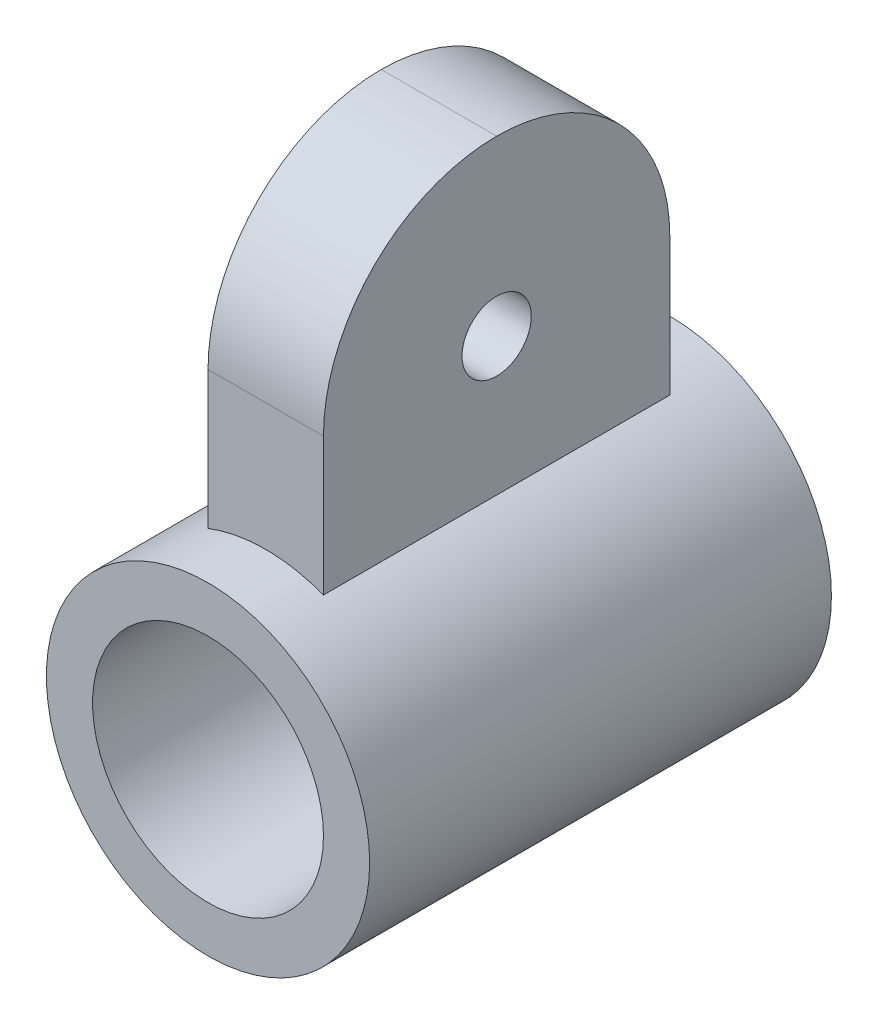
ISO-10303-21;
HEADER;
FILE_DESCRIPTION(('STEP AP214'),'2;1');
FILE_NAME('part.step','',(''),(''),'','','');
FILE_SCHEMA(('AUTOMOTIVE_DESIGN { 1 0 10303 214 1 1 1 1 }'));
ENDSEC;
DATA;
#1=APPLICATION_CONTEXT('core data for automotive mechanical design processes');
#2=APPLICATION_PROTOCOL_DEFINITION('international standard','automotive_design',2000,#1);
#3=PRODUCT_CONTEXT('',#1,'mechanical');
#4=PRODUCT('Part','Part','',(#3));
#5=PRODUCT_RELATED_PRODUCT_CATEGORY('part','',(#4));
#6=PRODUCT_DEFINITION_FORMATION('','',#4);
#7=PRODUCT_DEFINITION_CONTEXT('part definition',#1,'design');
#8=PRODUCT_DEFINITION('design','',#6,#7);
#9=PRODUCT_DEFINITION_SHAPE('','',#8);
#10=(LENGTH_UNIT() NAMED_UNIT(*) SI_UNIT(.MILLI.,.METRE.));
#11=(NAMED_UNIT(*) PLANE_ANGLE_UNIT() SI_UNIT($,.RADIAN.));
#12=(NAMED_UNIT(*) SI_UNIT($,.STERADIAN.) SOLID_ANGLE_UNIT());
#13=UNCERTAINTY_MEASURE_WITH_UNIT(LENGTH_MEASURE(1.E-05),#10,'distance_accuracy_value','');
#14=(GEOMETRIC_REPRESENTATION_CONTEXT(3) GLOBAL_UNCERTAINTY_ASSIGNED_CONTEXT((#13)) GLOBAL_UNIT_ASSIGNED_CONTEXT((#10,
#11,#12)) REPRESENTATION_CONTEXT('',''));
#15=CARTESIAN_POINT('',(0.,0.,0.));
#16=DIRECTION('',(0.,0.,1.));
#17=DIRECTION('',(1.,0.,0.));
#18=AXIS2_PLACEMENT_3D('',#15,#16,#17);
#19=CARTESIAN_POINT('',(0.,0.,20.));
#20=DIRECTION('',(0.,0.,1.));
#21=DIRECTION('',(1.,0.,0.));
#22=AXIS2_PLACEMENT_3D('',#19,#20,#21);
#23=PLANE('',#22);
#24=CARTESIAN_POINT('',(0.,0.,20.));
#25=DIRECTION('',(0.,0.,1.));
#26=DIRECTION('',(1.,0.,0.));
#27=AXIS2_PLACEMENT_3D('',#24,#25,#26);
#28=CIRCLE('',#27,14.);
#29=CARTESIAN_POINT('',(14.,0.,20.));
#30=VERTEX_POINT('',#29);
#31=EDGE_CURVE('E116',#30,#30,#28,.T.);
#32=ORIENTED_EDGE('',*,*,#31,.T.);
#33=EDGE_LOOP('',(#32));
#34=FACE_BOUND('',#33,.T.);
#35=CARTESIAN_POINT('',(0.,0.,20.));
#36=DIRECTION('',(0.,0.,1.));
#37=DIRECTION('',(1.,0.,0.));
#38=AXIS2_PLACEMENT_3D('',#35,#36,#37);
#39=CIRCLE('',#38,10.);
#40=CARTESIAN_POINT('',(10.,0.,20.));
#41=VERTEX_POINT('',#40);
#42=EDGE_CURVE('E110',#41,#41,#39,.T.);
#43=ORIENTED_EDGE('',*,*,#42,.F.);
#44=EDGE_LOOP('',(#43));
#45=FACE_BOUND('',#44,.T.);
#46=ADVANCED_FACE('F32',(#34,#45),#23,.T.);
#47=CARTESIAN_POINT('',(0.,0.,-20.));
#48=DIRECTION('',(0.,0.,1.));
#49=DIRECTION('',(1.,0.,0.));
#50=AXIS2_PLACEMENT_3D('',#47,#48,#49);
#51=PLANE('',#50);
#52=CARTESIAN_POINT('',(0.,0.,-20.));
#53=DIRECTION('',(0.,0.,1.));
#54=DIRECTION('',(1.,0.,0.));
#55=AXIS2_PLACEMENT_3D('',#52,#53,#54);
#56=CIRCLE('',#55,14.);
#57=CARTESIAN_POINT('',(14.,0.,-20.));
#58=VERTEX_POINT('',#57);
#59=EDGE_CURVE('E113',#58,#58,#56,.T.);
#60=ORIENTED_EDGE('',*,*,#59,.F.);
#61=EDGE_LOOP('',(#60));
#62=FACE_BOUND('',#61,.T.);
#63=CARTESIAN_POINT('',(0.,0.,-20.));
#64=DIRECTION('',(0.,0.,1.));
#65=DIRECTION('',(1.,0.,0.));
#66=AXIS2_PLACEMENT_3D('',#63,#64,#65);
#67=CIRCLE('',#66,10.);
#68=CARTESIAN_POINT('',(10.,0.,-20.));
#69=VERTEX_POINT('',#68);
#70=EDGE_CURVE('E105',#69,#69,#67,.T.);
#71=ORIENTED_EDGE('',*,*,#70,.T.);
#72=EDGE_LOOP('',(#71));
#73=FACE_BOUND('',#72,.T.);
#74=ADVANCED_FACE('F158',(#62,#73),#51,.F.);
#75=CARTESIAN_POINT('',(0.,0.,20.));
#76=DIRECTION('',(0.,0.,-1.));
#77=DIRECTION('',(-1.,0.,0.));
#78=AXIS2_PLACEMENT_3D('',#75,#76,#77);
#79=CYLINDRICAL_SURFACE('',#78,14.);
#80=DIRECTION('',(0.,0.,-1.));
#81=VECTOR('',#80,1.);
#82=CARTESIAN_POINT('',(-5.,13.076696830622,20.));
#83=LINE('',#82,#81);
#84=CARTESIAN_POINT('',(-5.,13.076696830622,-15.));
#85=VERTEX_POINT('',#84);
#86=CARTESIAN_POINT('',(-5.,13.076696830622,15.));
#87=VERTEX_POINT('',#86);
#88=EDGE_CURVE('E78',#85,#87,#83,.F.);
#89=ORIENTED_EDGE('',*,*,#88,.F.);
#90=CARTESIAN_POINT('',(0.,0.,-15.));
#91=DIRECTION('',(0.,0.,-1.));
#92=DIRECTION('',(-1.,0.,0.));
#93=AXIS2_PLACEMENT_3D('',#90,#91,#92);
#94=CIRCLE('',#93,14.);
#95=CARTESIAN_POINT('',(5.,13.076696830622,-15.));
#96=VERTEX_POINT('',#95);
#97=EDGE_CURVE('E87',#96,#85,#94,.F.);
#98=ORIENTED_EDGE('',*,*,#97,.F.);
#99=DIRECTION('',(0.,0.,-1.));
#100=VECTOR('',#99,1.);
#101=CARTESIAN_POINT('',(5.,13.076696830622,20.));
#102=LINE('',#101,#100);
#103=CARTESIAN_POINT('',(5.,13.076696830622,15.));
#104=VERTEX_POINT('',#103);
#105=EDGE_CURVE('E98',#104,#96,#102,.T.);
#106=ORIENTED_EDGE('',*,*,#105,.F.);
#107=CARTESIAN_POINT('',(0.,0.,15.));
#108=DIRECTION('',(0.,0.,1.));
#109=DIRECTION('',(1.,0.,0.));
#110=AXIS2_PLACEMENT_3D('',#107,#108,#109);
#111=CIRCLE('',#110,14.);
#112=EDGE_CURVE('E96',#87,#104,#111,.F.);
#113=ORIENTED_EDGE('',*,*,#112,.F.);
#114=EDGE_LOOP('',(#89,#98,#106,#113));
#115=FACE_BOUND('',#114,.T.);
#116=ORIENTED_EDGE('',*,*,#31,.F.);
#117=EDGE_LOOP('',(#116));
#118=FACE_BOUND('',#117,.T.);
#119=ORIENTED_EDGE('',*,*,#59,.T.);
#120=EDGE_LOOP('',(#119));
#121=FACE_BOUND('',#120,.T.);
#122=ADVANCED_FACE('F94',(#115,#118,#121),#79,.T.);
#123=CARTESIAN_POINT('',(0.,0.,20.));
#124=DIRECTION('',(0.,0.,-1.));
#125=DIRECTION('',(-1.,0.,0.));
#126=AXIS2_PLACEMENT_3D('',#123,#124,#125);
#127=CYLINDRICAL_SURFACE('',#126,10.);
#128=ORIENTED_EDGE('',*,*,#42,.T.);
#129=EDGE_LOOP('',(#128));
#130=FACE_BOUND('',#129,.T.);
#131=ORIENTED_EDGE('',*,*,#70,.F.);
#132=EDGE_LOOP('',(#131));
#133=FACE_BOUND('',#132,.T.);
#134=ADVANCED_FACE('F168',(#130,#133),#127,.F.);
#135=CARTESIAN_POINT('',(-5.,-14.001,-15.));
#136=DIRECTION('',(0.,0.,-1.));
#137=DIRECTION('',(-1.,0.,0.));
#138=AXIS2_PLACEMENT_3D('',#135,#136,#137);
#139=PLANE('',#138);
#140=DIRECTION('',(0.,1.,0.));
#141=VECTOR('',#140,1.);
#142=CARTESIAN_POINT('',(-5.,-14.001,-15.));
#143=LINE('',#142,#141);
#144=CARTESIAN_POINT('',(-5.,25.,-15.));
#145=VERTEX_POINT('',#144);
#146=EDGE_CURVE('E74',#85,#145,#143,.T.);
#147=ORIENTED_EDGE('',*,*,#146,.T.);
#148=DIRECTION('',(-1.,0.,0.));
#149=VECTOR('',#148,1.);
#150=CARTESIAN_POINT('',(-5.,25.,-15.));
#151=LINE('',#150,#149);
#152=CARTESIAN_POINT('',(5.,25.,-15.));
#153=VERTEX_POINT('',#152);
#154=EDGE_CURVE('E11',#145,#153,#151,.F.);
#155=ORIENTED_EDGE('',*,*,#154,.T.);
#156=DIRECTION('',(0.,1.,0.));
#157=VECTOR('',#156,1.);
#158=CARTESIAN_POINT('',(5.,-14.001,-15.));
#159=LINE('',#158,#157);
#160=EDGE_CURVE('E83',#96,#153,#159,.T.);
#161=ORIENTED_EDGE('',*,*,#160,.F.);
#162=ORIENTED_EDGE('',*,*,#97,.T.);
#163=EDGE_LOOP('',(#147,#155,#161,#162));
#164=FACE_BOUND('',#163,.T.);
#165=ADVANCED_FACE('F88',(#164),#139,.T.);
#166=CARTESIAN_POINT('',(-5.,-14.001,-15.));
#167=DIRECTION('',(-1.,0.,0.));
#168=DIRECTION('',(0.,0.,1.));
#169=AXIS2_PLACEMENT_3D('',#166,#167,#168);
#170=PLANE('',#169);
#171=CARTESIAN_POINT('',(-5.,25.,0.));
#172=DIRECTION('',(-1.,0.,0.));
#173=DIRECTION('',(0.,0.,1.));
#174=AXIS2_PLACEMENT_3D('',#171,#172,#173);
#175=CIRCLE('',#174,3.);
#176=CARTESIAN_POINT('',(-5.,25.,3.));
#177=VERTEX_POINT('',#176);
#178=EDGE_CURVE('E140',#177,#177,#175,.T.);
#179=ORIENTED_EDGE('',*,*,#178,.F.);
#180=EDGE_LOOP('',(#179));
#181=FACE_BOUND('',#180,.T.);
#182=DIRECTION('',(0.,1.,0.));
#183=VECTOR('',#182,1.);
#184=CARTESIAN_POINT('',(-5.,-14.001,15.));
#185=LINE('',#184,#183);
#186=CARTESIAN_POINT('',(-5.,25.,15.));
#187=VERTEX_POINT('',#186);
#188=EDGE_CURVE('E82',#87,#187,#185,.T.);
#189=ORIENTED_EDGE('',*,*,#188,.T.);
#190=CARTESIAN_POINT('',(-5.,25.,0.));
#191=DIRECTION('',(-1.,0.,0.));
#192=DIRECTION('',(0.,0.,1.));
#193=AXIS2_PLACEMENT_3D('',#190,#191,#192);
#194=CIRCLE('',#193,15.);
#195=CARTESIAN_POINT('',(-5.,40.,0.));
#196=VERTEX_POINT('',#195);
#197=EDGE_CURVE('E41',#187,#196,#194,.T.);
#198=ORIENTED_EDGE('',*,*,#197,.T.);
#199=CARTESIAN_POINT('',(-5.,25.,0.));
#200=DIRECTION('',(-1.,0.,0.));
#201=DIRECTION('',(0.,0.,1.));
#202=AXIS2_PLACEMENT_3D('',#199,#200,#201);
#203=CIRCLE('',#202,15.);
#204=EDGE_CURVE('E51',#196,#145,#203,.T.);
#205=ORIENTED_EDGE('',*,*,#204,.T.);
#206=ORIENTED_EDGE('',*,*,#146,.F.);
#207=ORIENTED_EDGE('',*,*,#88,.T.);
#208=EDGE_LOOP('',(#189,#198,#205,#206,#207));
#209=FACE_BOUND('',#208,.T.);
#210=ADVANCED_FACE('F76',(#181,#209),#170,.T.);
#211=CARTESIAN_POINT('',(-5.,-14.001,15.));
#212=DIRECTION('',(0.,0.,1.));
#213=DIRECTION('',(1.,0.,0.));
#214=AXIS2_PLACEMENT_3D('',#211,#212,#213);
#215=PLANE('',#214);
#216=DIRECTION('',(0.,1.,0.));
#217=VECTOR('',#216,1.);
#218=CARTESIAN_POINT('',(5.,-14.001,15.));
#219=LINE('',#218,#217);
#220=CARTESIAN_POINT('',(5.,25.,15.));
#221=VERTEX_POINT('',#220);
#222=EDGE_CURVE('E92',#104,#221,#219,.T.);
#223=ORIENTED_EDGE('',*,*,#222,.T.);
#224=DIRECTION('',(1.,0.,0.));
#225=VECTOR('',#224,1.);
#226=CARTESIAN_POINT('',(-5.,25.,15.));
#227=LINE('',#226,#225);
#228=EDGE_CURVE('E125',#221,#187,#227,.F.);
#229=ORIENTED_EDGE('',*,*,#228,.T.);
#230=ORIENTED_EDGE('',*,*,#188,.F.);
#231=ORIENTED_EDGE('',*,*,#112,.T.);
#232=EDGE_LOOP('',(#223,#229,#230,#231));
#233=FACE_BOUND('',#232,.T.);
#234=ADVANCED_FACE('F131',(#233),#215,.T.);
#235=CARTESIAN_POINT('',(5.,-14.001,-15.));
#236=DIRECTION('',(1.,0.,0.));
#237=DIRECTION('',(0.,0.,-1.));
#238=AXIS2_PLACEMENT_3D('',#235,#236,#237);
#239=PLANE('',#238);
#240=CARTESIAN_POINT('',(5.,25.,0.));
#241=DIRECTION('',(1.,0.,0.));
#242=DIRECTION('',(0.,0.,-1.));
#243=AXIS2_PLACEMENT_3D('',#240,#241,#242);
#244=CIRCLE('',#243,3.);
#245=CARTESIAN_POINT('',(5.,25.,-3.));
#246=VERTEX_POINT('',#245);
#247=EDGE_CURVE('E101',#246,#246,#244,.F.);
#248=ORIENTED_EDGE('',*,*,#247,.T.);
#249=EDGE_LOOP('',(#248));
#250=FACE_BOUND('',#249,.T.);
#251=CARTESIAN_POINT('',(5.,25.,0.));
#252=DIRECTION('',(1.,0.,0.));
#253=DIRECTION('',(0.,0.,-1.));
#254=AXIS2_PLACEMENT_3D('',#251,#252,#253);
#255=CIRCLE('',#254,15.);
#256=CARTESIAN_POINT('',(5.,40.,0.));
#257=VERTEX_POINT('',#256);
#258=EDGE_CURVE('E119',#153,#257,#255,.T.);
#259=ORIENTED_EDGE('',*,*,#258,.T.);
#260=CARTESIAN_POINT('',(5.,25.,0.));
#261=DIRECTION('',(1.,0.,0.));
#262=DIRECTION('',(0.,0.,-1.));
#263=AXIS2_PLACEMENT_3D('',#260,#261,#262);
#264=CIRCLE('',#263,15.);
#265=EDGE_CURVE('E123',#257,#221,#264,.T.);
#266=ORIENTED_EDGE('',*,*,#265,.T.);
#267=ORIENTED_EDGE('',*,*,#222,.F.);
#268=ORIENTED_EDGE('',*,*,#105,.T.);
#269=ORIENTED_EDGE('',*,*,#160,.T.);
#270=EDGE_LOOP('',(#259,#266,#267,#268,#269));
#271=FACE_BOUND('',#270,.T.);
#272=ADVANCED_FACE('F147',(#250,#271),#239,.T.);
#273=CARTESIAN_POINT('',(0.,25.,0.));
#274=DIRECTION('',(-1.,0.,0.));
#275=DIRECTION('',(0.,0.,1.));
#276=AXIS2_PLACEMENT_3D('',#273,#274,#275);
#277=CYLINDRICAL_SURFACE('',#276,15.);
#278=ORIENTED_EDGE('',*,*,#154,.F.);
#279=ORIENTED_EDGE('',*,*,#204,.F.);
#280=DIRECTION('',(-1.,0.,0.));
#281=VECTOR('',#280,1.);
#282=CARTESIAN_POINT('',(0.,40.,0.));
#283=LINE('',#282,#281);
#284=EDGE_CURVE('E36',#257,#196,#283,.T.);
#285=ORIENTED_EDGE('',*,*,#284,.F.);
#286=ORIENTED_EDGE('',*,*,#258,.F.);
#287=EDGE_LOOP('',(#278,#279,#285,#286));
#288=FACE_BOUND('',#287,.T.);
#289=ADVANCED_FACE('F34',(#288),#277,.T.);
#290=CARTESIAN_POINT('',(0.,25.,0.));
#291=DIRECTION('',(1.,0.,0.));
#292=DIRECTION('',(0.,0.,-1.));
#293=AXIS2_PLACEMENT_3D('',#290,#291,#292);
#294=CYLINDRICAL_SURFACE('',#293,15.);
#295=ORIENTED_EDGE('',*,*,#197,.F.);
#296=ORIENTED_EDGE('',*,*,#228,.F.);
#297=ORIENTED_EDGE('',*,*,#265,.F.);
#298=ORIENTED_EDGE('',*,*,#284,.T.);
#299=EDGE_LOOP('',(#295,#296,#297,#298));
#300=FACE_BOUND('',#299,.T.);
#301=ADVANCED_FACE('F135',(#300),#294,.T.);
#302=CARTESIAN_POINT('',(14.001,25.,0.));
#303=DIRECTION('',(-1.,0.,0.));
#304=DIRECTION('',(0.,0.,1.));
#305=AXIS2_PLACEMENT_3D('',#302,#303,#304);
#306=CYLINDRICAL_SURFACE('',#305,3.);
#307=ORIENTED_EDGE('',*,*,#247,.F.);
#308=EDGE_LOOP('',(#307));
#309=FACE_BOUND('',#308,.T.);
#310=ORIENTED_EDGE('',*,*,#178,.T.);
#311=EDGE_LOOP('',(#310));
#312=FACE_BOUND('',#311,.T.);
#313=ADVANCED_FACE('F150',(#309,#312),#306,.F.);
#314=CLOSED_SHELL('',(#46,#74,#122,#134,#165,#210,#234,#272,#289,#301,#313));
#315=MANIFOLD_SOLID_BREP('B2',#314);
#316=ADVANCED_BREP_SHAPE_REPRESENTATION('',(#18,#315),#14);
#317=SHAPE_DEFINITION_REPRESENTATION(#9,#316);
ENDSEC;
END-ISO-10303-21;
